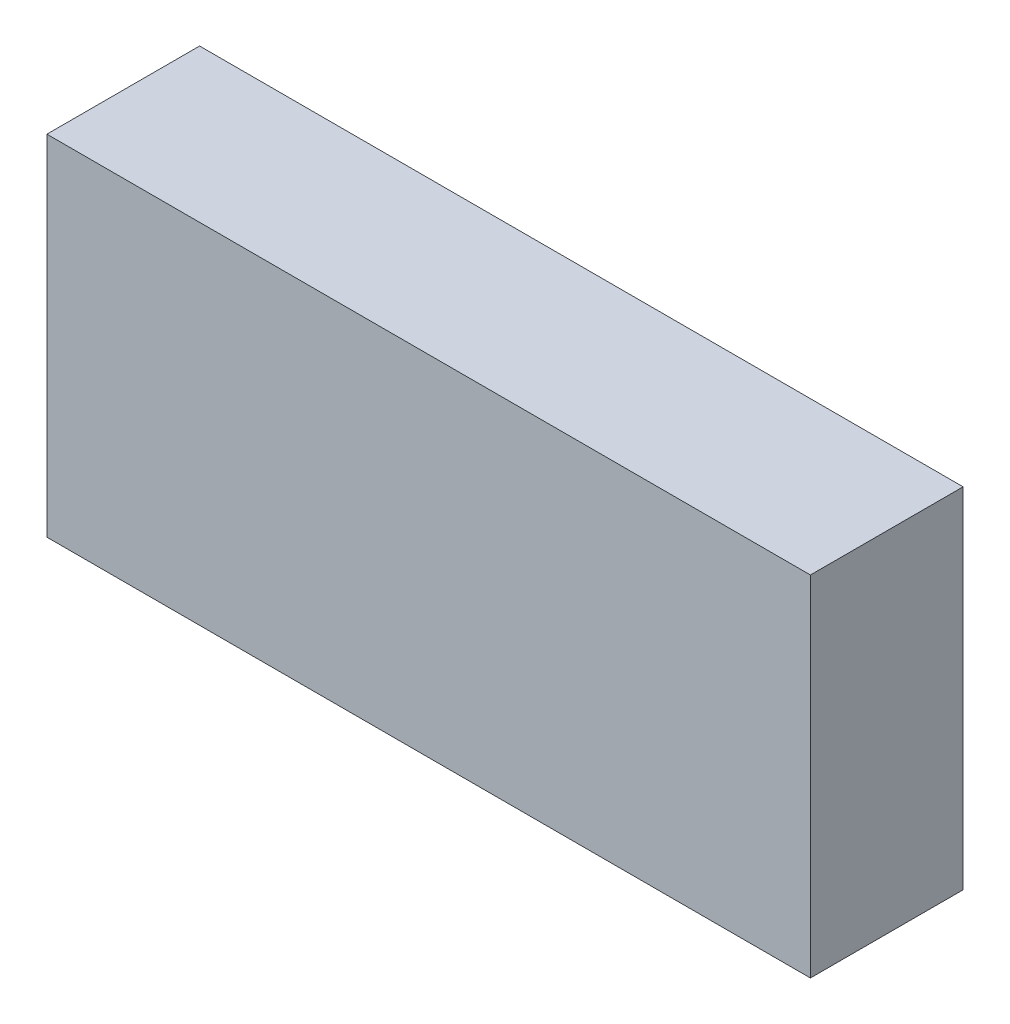
ISO-10303-21;
HEADER;
FILE_DESCRIPTION(('STEP AP214'),'2;1');
FILE_NAME('part.step','',(''),(''),'','','');
FILE_SCHEMA(('AUTOMOTIVE_DESIGN { 1 0 10303 214 1 1 1 1 }'));
ENDSEC;
DATA;
#1=APPLICATION_CONTEXT('core data for automotive mechanical design processes');
#2=APPLICATION_PROTOCOL_DEFINITION('international standard','automotive_design',2000,#1);
#3=PRODUCT_CONTEXT('',#1,'mechanical');
#4=PRODUCT('Part','Part','',(#3));
#5=PRODUCT_RELATED_PRODUCT_CATEGORY('part','',(#4));
#6=PRODUCT_DEFINITION_FORMATION('','',#4);
#7=PRODUCT_DEFINITION_CONTEXT('part definition',#1,'design');
#8=PRODUCT_DEFINITION('design','',#6,#7);
#9=PRODUCT_DEFINITION_SHAPE('','',#8);
#10=(LENGTH_UNIT() NAMED_UNIT(*) SI_UNIT(.MILLI.,.METRE.));
#11=(NAMED_UNIT(*) PLANE_ANGLE_UNIT() SI_UNIT($,.RADIAN.));
#12=(NAMED_UNIT(*) SI_UNIT($,.STERADIAN.) SOLID_ANGLE_UNIT());
#13=UNCERTAINTY_MEASURE_WITH_UNIT(LENGTH_MEASURE(1.E-05),#10,'distance_accuracy_value','');
#14=(GEOMETRIC_REPRESENTATION_CONTEXT(3) GLOBAL_UNCERTAINTY_ASSIGNED_CONTEXT((#13)) GLOBAL_UNIT_ASSIGNED_CONTEXT((#10,
#11,#12)) REPRESENTATION_CONTEXT('',''));
#15=CARTESIAN_POINT('',(0.,0.,0.));
#16=DIRECTION('',(0.,0.,1.));
#17=DIRECTION('',(1.,0.,0.));
#18=AXIS2_PLACEMENT_3D('',#15,#16,#17);
#19=CARTESIAN_POINT('',(-4.37500014,2.00000108,1.74999904));
#20=DIRECTION('',(0.,0.,-1.));
#21=DIRECTION('',(0.,-1.,0.));
#22=AXIS2_PLACEMENT_3D('',#19,#20,#21);
#23=PLANE('',#22);
#24=DIRECTION('',(0.,-1.,0.));
#25=VECTOR('',#24,1.);
#26=CARTESIAN_POINT('',(-4.37500014,2.00000108,1.74999904));
#27=LINE('',#26,#25);
#28=CARTESIAN_POINT('',(-4.37500014,2.00000108,1.74999904));
#29=VERTEX_POINT('',#28);
#30=CARTESIAN_POINT('',(-4.37500014,-2.00000108,1.74999904));
#31=VERTEX_POINT('',#30);
#32=EDGE_CURVE('E75',#29,#31,#27,.T.);
#33=ORIENTED_EDGE('',*,*,#32,.T.);
#34=DIRECTION('',(1.,0.,0.));
#35=VECTOR('',#34,1.);
#36=CARTESIAN_POINT('',(-4.37500014,-2.00000108,1.74999904));
#37=LINE('',#36,#35);
#38=CARTESIAN_POINT('',(4.37500014,-2.00000108,1.74999904));
#39=VERTEX_POINT('',#38);
#40=EDGE_CURVE('E101',#31,#39,#37,.T.);
#41=ORIENTED_EDGE('',*,*,#40,.T.);
#42=DIRECTION('',(0.,1.,0.));
#43=VECTOR('',#42,1.);
#44=CARTESIAN_POINT('',(4.37500014,-2.00000108,1.74999904));
#45=LINE('',#44,#43);
#46=CARTESIAN_POINT('',(4.37500014,2.00000108,1.74999904));
#47=VERTEX_POINT('',#46);
#48=EDGE_CURVE('E77',#39,#47,#45,.T.);
#49=ORIENTED_EDGE('',*,*,#48,.T.);
#50=DIRECTION('',(-1.,0.,0.));
#51=VECTOR('',#50,1.);
#52=CARTESIAN_POINT('',(4.37500014,2.00000108,1.74999904));
#53=LINE('',#52,#51);
#54=EDGE_CURVE('E11',#47,#29,#53,.T.);
#55=ORIENTED_EDGE('',*,*,#54,.T.);
#56=EDGE_LOOP('',(#33,#41,#49,#55));
#57=FACE_BOUND('',#56,.T.);
#58=ADVANCED_FACE('F16',(#57),#23,.F.);
#59=CARTESIAN_POINT('',(-4.37500014,2.00000108,0.));
#60=DIRECTION('',(0.,0.,-1.));
#61=DIRECTION('',(0.,-1.,0.));
#62=AXIS2_PLACEMENT_3D('',#59,#60,#61);
#63=PLANE('',#62);
#64=DIRECTION('',(-1.,0.,0.));
#65=VECTOR('',#64,1.);
#66=CARTESIAN_POINT('',(4.37500014,2.00000108,0.));
#67=LINE('',#66,#65);
#68=CARTESIAN_POINT('',(4.37500014,2.00000108,0.));
#69=VERTEX_POINT('',#68);
#70=CARTESIAN_POINT('',(-4.37500014,2.00000108,0.));
#71=VERTEX_POINT('',#70);
#72=EDGE_CURVE('E27',#69,#71,#67,.T.);
#73=ORIENTED_EDGE('',*,*,#72,.F.);
#74=DIRECTION('',(0.,1.,0.));
#75=VECTOR('',#74,1.);
#76=CARTESIAN_POINT('',(4.37500014,-2.00000108,0.));
#77=LINE('',#76,#75);
#78=CARTESIAN_POINT('',(4.37500014,-2.00000108,0.));
#79=VERTEX_POINT('',#78);
#80=EDGE_CURVE('E104',#79,#69,#77,.T.);
#81=ORIENTED_EDGE('',*,*,#80,.F.);
#82=DIRECTION('',(1.,0.,0.));
#83=VECTOR('',#82,1.);
#84=CARTESIAN_POINT('',(-4.37500014,-2.00000108,0.));
#85=LINE('',#84,#83);
#86=CARTESIAN_POINT('',(-4.37500014,-2.00000108,0.));
#87=VERTEX_POINT('',#86);
#88=EDGE_CURVE('E53',#87,#79,#85,.T.);
#89=ORIENTED_EDGE('',*,*,#88,.F.);
#90=DIRECTION('',(0.,-1.,0.));
#91=VECTOR('',#90,1.);
#92=CARTESIAN_POINT('',(-4.37500014,2.00000108,0.));
#93=LINE('',#92,#91);
#94=EDGE_CURVE('E93',#71,#87,#93,.T.);
#95=ORIENTED_EDGE('',*,*,#94,.F.);
#96=EDGE_LOOP('',(#73,#81,#89,#95));
#97=FACE_BOUND('',#96,.T.);
#98=ADVANCED_FACE('F121',(#97),#63,.T.);
#99=CARTESIAN_POINT('',(4.37500014,2.00000108,0.));
#100=DIRECTION('',(0.,-1.,0.));
#101=DIRECTION('',(0.,0.,-1.));
#102=AXIS2_PLACEMENT_3D('',#99,#100,#101);
#103=PLANE('',#102);
#104=ORIENTED_EDGE('',*,*,#72,.T.);
#105=DIRECTION('',(0.,0.,1.));
#106=VECTOR('',#105,1.);
#107=CARTESIAN_POINT('',(-4.37500014,2.00000108,0.));
#108=LINE('',#107,#106);
#109=EDGE_CURVE('E79',#71,#29,#108,.T.);
#110=ORIENTED_EDGE('',*,*,#109,.T.);
#111=ORIENTED_EDGE('',*,*,#54,.F.);
#112=DIRECTION('',(0.,0.,1.));
#113=VECTOR('',#112,1.);
#114=CARTESIAN_POINT('',(4.37500014,2.00000108,0.));
#115=LINE('',#114,#113);
#116=EDGE_CURVE('E20',#69,#47,#115,.T.);
#117=ORIENTED_EDGE('',*,*,#116,.F.);
#118=EDGE_LOOP('',(#104,#110,#111,#117));
#119=FACE_BOUND('',#118,.T.);
#120=ADVANCED_FACE('F80',(#119),#103,.F.);
#121=CARTESIAN_POINT('',(4.37500014,-2.00000108,0.));
#122=DIRECTION('',(-1.,0.,0.));
#123=DIRECTION('',(0.,0.,1.));
#124=AXIS2_PLACEMENT_3D('',#121,#122,#123);
#125=PLANE('',#124);
#126=ORIENTED_EDGE('',*,*,#80,.T.);
#127=ORIENTED_EDGE('',*,*,#116,.T.);
#128=ORIENTED_EDGE('',*,*,#48,.F.);
#129=DIRECTION('',(0.,0.,1.));
#130=VECTOR('',#129,1.);
#131=CARTESIAN_POINT('',(4.37500014,-2.00000108,0.));
#132=LINE('',#131,#130);
#133=EDGE_CURVE('E97',#79,#39,#132,.T.);
#134=ORIENTED_EDGE('',*,*,#133,.F.);
#135=EDGE_LOOP('',(#126,#127,#128,#134));
#136=FACE_BOUND('',#135,.T.);
#137=ADVANCED_FACE('F18',(#136),#125,.F.);
#138=CARTESIAN_POINT('',(-4.37500014,-2.00000108,0.));
#139=DIRECTION('',(0.,1.,0.));
#140=DIRECTION('',(1.,0.,0.));
#141=AXIS2_PLACEMENT_3D('',#138,#139,#140);
#142=PLANE('',#141);
#143=ORIENTED_EDGE('',*,*,#88,.T.);
#144=ORIENTED_EDGE('',*,*,#133,.T.);
#145=ORIENTED_EDGE('',*,*,#40,.F.);
#146=DIRECTION('',(0.,0.,1.));
#147=VECTOR('',#146,1.);
#148=CARTESIAN_POINT('',(-4.37500014,-2.00000108,0.));
#149=LINE('',#148,#147);
#150=EDGE_CURVE('E86',#87,#31,#149,.T.);
#151=ORIENTED_EDGE('',*,*,#150,.F.);
#152=EDGE_LOOP('',(#143,#144,#145,#151));
#153=FACE_BOUND('',#152,.T.);
#154=ADVANCED_FACE('F133',(#153),#142,.F.);
#155=CARTESIAN_POINT('',(-4.37500014,2.00000108,0.));
#156=DIRECTION('',(1.,0.,0.));
#157=DIRECTION('',(0.,1.,0.));
#158=AXIS2_PLACEMENT_3D('',#155,#156,#157);
#159=PLANE('',#158);
#160=ORIENTED_EDGE('',*,*,#94,.T.);
#161=ORIENTED_EDGE('',*,*,#150,.T.);
#162=ORIENTED_EDGE('',*,*,#32,.F.);
#163=ORIENTED_EDGE('',*,*,#109,.F.);
#164=EDGE_LOOP('',(#160,#161,#162,#163));
#165=FACE_BOUND('',#164,.T.);
#166=ADVANCED_FACE('F85',(#165),#159,.F.);
#167=CLOSED_SHELL('',(#58,#98,#120,#137,#154,#166));
#168=MANIFOLD_SOLID_BREP('B1',#167);
#169=ADVANCED_BREP_SHAPE_REPRESENTATION('',(#18,#168),#14);
#170=SHAPE_DEFINITION_REPRESENTATION(#9,#169);
ENDSEC;
END-ISO-10303-21;
